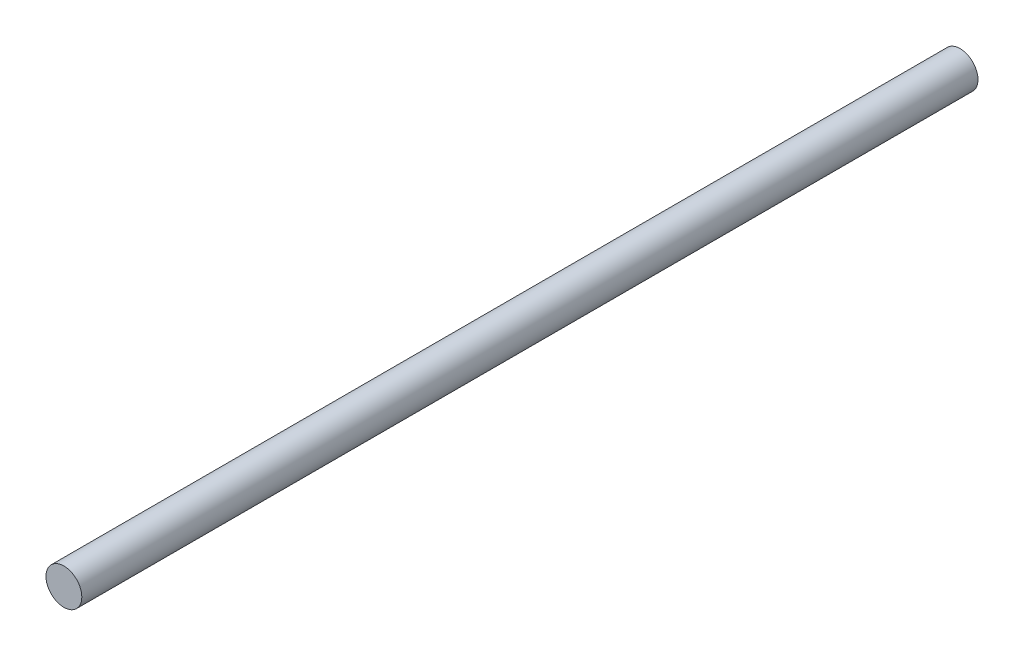
ISO-10303-21;
HEADER;
FILE_DESCRIPTION(('STEP AP214'),'2;1');
FILE_NAME('part.step','',(''),(''),'','','');
FILE_SCHEMA(('AUTOMOTIVE_DESIGN { 1 0 10303 214 1 1 1 1 }'));
ENDSEC;
DATA;
#1=APPLICATION_CONTEXT('core data for automotive mechanical design processes');
#2=APPLICATION_PROTOCOL_DEFINITION('international standard','automotive_design',2000,#1);
#3=PRODUCT_CONTEXT('',#1,'mechanical');
#4=PRODUCT('Part','Part','',(#3));
#5=PRODUCT_RELATED_PRODUCT_CATEGORY('part','',(#4));
#6=PRODUCT_DEFINITION_FORMATION('','',#4);
#7=PRODUCT_DEFINITION_CONTEXT('part definition',#1,'design');
#8=PRODUCT_DEFINITION('design','',#6,#7);
#9=PRODUCT_DEFINITION_SHAPE('','',#8);
#10=(LENGTH_UNIT() NAMED_UNIT(*) SI_UNIT(.MILLI.,.METRE.));
#11=(NAMED_UNIT(*) PLANE_ANGLE_UNIT() SI_UNIT($,.RADIAN.));
#12=(NAMED_UNIT(*) SI_UNIT($,.STERADIAN.) SOLID_ANGLE_UNIT());
#13=UNCERTAINTY_MEASURE_WITH_UNIT(LENGTH_MEASURE(1.E-05),#10,'distance_accuracy_value','');
#14=(GEOMETRIC_REPRESENTATION_CONTEXT(3) GLOBAL_UNCERTAINTY_ASSIGNED_CONTEXT((#13)) GLOBAL_UNIT_ASSIGNED_CONTEXT((#10,
#11,#12)) REPRESENTATION_CONTEXT('',''));
#15=CARTESIAN_POINT('',(0.,0.,0.));
#16=DIRECTION('',(0.,0.,1.));
#17=DIRECTION('',(1.,0.,0.));
#18=AXIS2_PLACEMENT_3D('',#15,#16,#17);
#19=CARTESIAN_POINT('',(0.,0.,150.));
#20=DIRECTION('',(0.,0.,-1.));
#21=DIRECTION('',(-1.,0.,0.));
#22=AXIS2_PLACEMENT_3D('',#19,#20,#21);
#23=CYLINDRICAL_SURFACE('',#22,3.);
#24=CARTESIAN_POINT('',(0.,0.,150.));
#25=DIRECTION('',(0.,0.,1.));
#26=DIRECTION('',(1.,0.,0.));
#27=AXIS2_PLACEMENT_3D('',#24,#25,#26);
#28=CIRCLE('',#27,3.);
#29=CARTESIAN_POINT('',(3.,0.,150.));
#30=VERTEX_POINT('',#29);
#31=EDGE_CURVE('E10',#30,#30,#28,.T.);
#32=ORIENTED_EDGE('',*,*,#31,.F.);
#33=EDGE_LOOP('',(#32));
#34=FACE_BOUND('',#33,.T.);
#35=CARTESIAN_POINT('',(0.,0.,0.));
#36=DIRECTION('',(0.,0.,1.));
#37=DIRECTION('',(1.,0.,0.));
#38=AXIS2_PLACEMENT_3D('',#35,#36,#37);
#39=CIRCLE('',#38,3.);
#40=CARTESIAN_POINT('',(3.,0.,0.));
#41=VERTEX_POINT('',#40);
#42=EDGE_CURVE('E36',#41,#41,#39,.T.);
#43=ORIENTED_EDGE('',*,*,#42,.T.);
#44=EDGE_LOOP('',(#43));
#45=FACE_BOUND('',#44,.T.);
#46=ADVANCED_FACE('F33',(#34,#45),#23,.T.);
#47=CARTESIAN_POINT('',(0.,0.,150.));
#48=DIRECTION('',(0.,0.,1.));
#49=DIRECTION('',(1.,0.,0.));
#50=AXIS2_PLACEMENT_3D('',#47,#48,#49);
#51=PLANE('',#50);
#52=ORIENTED_EDGE('',*,*,#31,.T.);
#53=EDGE_LOOP('',(#52));
#54=FACE_BOUND('',#53,.T.);
#55=ADVANCED_FACE('F49',(#54),#51,.T.);
#56=CARTESIAN_POINT('',(0.,0.,0.));
#57=DIRECTION('',(0.,0.,1.));
#58=DIRECTION('',(1.,0.,0.));
#59=AXIS2_PLACEMENT_3D('',#56,#57,#58);
#60=PLANE('',#59);
#61=ORIENTED_EDGE('',*,*,#42,.F.);
#62=EDGE_LOOP('',(#61));
#63=FACE_BOUND('',#62,.T.);
#64=ADVANCED_FACE('F47',(#63),#60,.F.);
#65=CLOSED_SHELL('',(#46,#55,#64));
#66=MANIFOLD_SOLID_BREP('B2',#65);
#67=ADVANCED_BREP_SHAPE_REPRESENTATION('',(#18,#66),#14);
#68=SHAPE_DEFINITION_REPRESENTATION(#9,#67);
ENDSEC;
END-ISO-10303-21;
